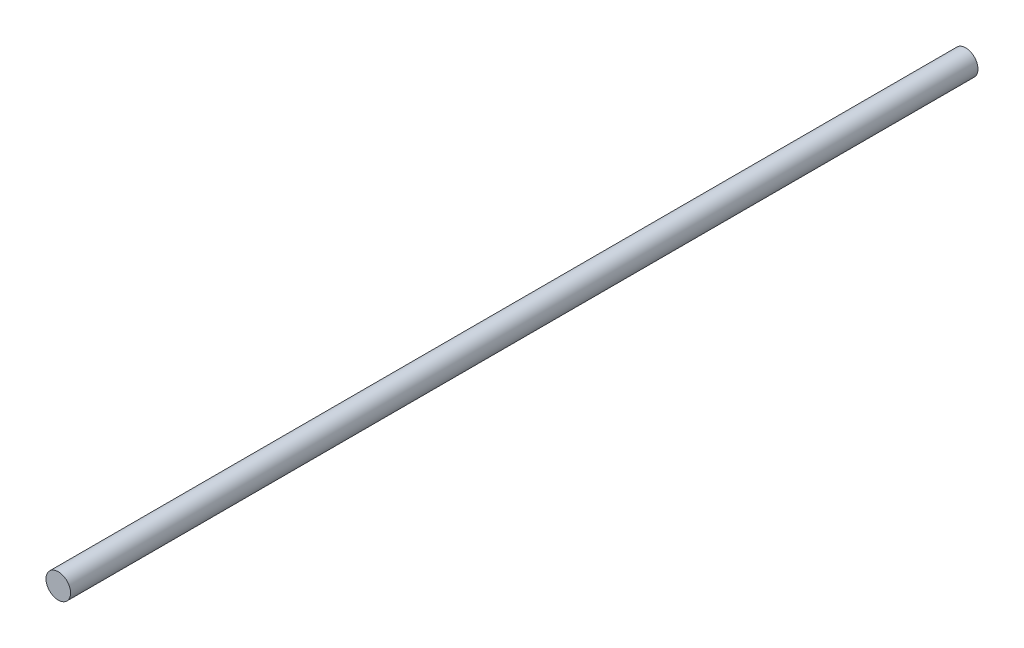
ISO-10303-21;
HEADER;
FILE_DESCRIPTION(('STEP AP214'),'2;1');
FILE_NAME('part.step','',(''),(''),'','','');
FILE_SCHEMA(('AUTOMOTIVE_DESIGN { 1 0 10303 214 1 1 1 1 }'));
ENDSEC;
DATA;
#1=APPLICATION_CONTEXT('core data for automotive mechanical design processes');
#2=APPLICATION_PROTOCOL_DEFINITION('international standard','automotive_design',2000,#1);
#3=PRODUCT_CONTEXT('',#1,'mechanical');
#4=PRODUCT('Part','Part','',(#3));
#5=PRODUCT_RELATED_PRODUCT_CATEGORY('part','',(#4));
#6=PRODUCT_DEFINITION_FORMATION('','',#4);
#7=PRODUCT_DEFINITION_CONTEXT('part definition',#1,'design');
#8=PRODUCT_DEFINITION('design','',#6,#7);
#9=PRODUCT_DEFINITION_SHAPE('','',#8);
#10=(LENGTH_UNIT() NAMED_UNIT(*) SI_UNIT(.MILLI.,.METRE.));
#11=(NAMED_UNIT(*) PLANE_ANGLE_UNIT() SI_UNIT($,.RADIAN.));
#12=(NAMED_UNIT(*) SI_UNIT($,.STERADIAN.) SOLID_ANGLE_UNIT());
#13=UNCERTAINTY_MEASURE_WITH_UNIT(LENGTH_MEASURE(1.E-05),#10,'distance_accuracy_value','');
#14=(GEOMETRIC_REPRESENTATION_CONTEXT(3) GLOBAL_UNCERTAINTY_ASSIGNED_CONTEXT((#13)) GLOBAL_UNIT_ASSIGNED_CONTEXT((#10,
#11,#12)) REPRESENTATION_CONTEXT('',''));
#15=CARTESIAN_POINT('',(0.,0.,0.));
#16=DIRECTION('',(0.,0.,1.));
#17=DIRECTION('',(1.,0.,0.));
#18=AXIS2_PLACEMENT_3D('',#15,#16,#17);
#19=CARTESIAN_POINT('',(0.,0.,295.));
#20=DIRECTION('',(0.,0.,-1.));
#21=DIRECTION('',(-1.,0.,0.));
#22=AXIS2_PLACEMENT_3D('',#19,#20,#21);
#23=CYLINDRICAL_SURFACE('',#22,4.);
#24=CARTESIAN_POINT('',(0.,0.,295.));
#25=DIRECTION('',(0.,0.,1.));
#26=DIRECTION('',(1.,0.,0.));
#27=AXIS2_PLACEMENT_3D('',#24,#25,#26);
#28=CIRCLE('',#27,4.);
#29=CARTESIAN_POINT('',(4.,0.,295.));
#30=VERTEX_POINT('',#29);
#31=EDGE_CURVE('E10',#30,#30,#28,.T.);
#32=ORIENTED_EDGE('',*,*,#31,.F.);
#33=EDGE_LOOP('',(#32));
#34=FACE_BOUND('',#33,.T.);
#35=CARTESIAN_POINT('',(0.,0.,0.));
#36=DIRECTION('',(0.,0.,1.));
#37=DIRECTION('',(1.,0.,0.));
#38=AXIS2_PLACEMENT_3D('',#35,#36,#37);
#39=CIRCLE('',#38,4.);
#40=CARTESIAN_POINT('',(4.,0.,0.));
#41=VERTEX_POINT('',#40);
#42=EDGE_CURVE('E38',#41,#41,#39,.T.);
#43=ORIENTED_EDGE('',*,*,#42,.T.);
#44=EDGE_LOOP('',(#43));
#45=FACE_BOUND('',#44,.T.);
#46=ADVANCED_FACE('F35',(#34,#45),#23,.T.);
#47=CARTESIAN_POINT('',(0.,0.,295.));
#48=DIRECTION('',(0.,0.,1.));
#49=DIRECTION('',(1.,0.,0.));
#50=AXIS2_PLACEMENT_3D('',#47,#48,#49);
#51=PLANE('',#50);
#52=ORIENTED_EDGE('',*,*,#31,.T.);
#53=EDGE_LOOP('',(#52));
#54=FACE_BOUND('',#53,.T.);
#55=ADVANCED_FACE('F50',(#54),#51,.T.);
#56=CARTESIAN_POINT('',(0.,0.,0.));
#57=DIRECTION('',(0.,0.,1.));
#58=DIRECTION('',(1.,0.,0.));
#59=AXIS2_PLACEMENT_3D('',#56,#57,#58);
#60=PLANE('',#59);
#61=ORIENTED_EDGE('',*,*,#42,.F.);
#62=EDGE_LOOP('',(#61));
#63=FACE_BOUND('',#62,.T.);
#64=ADVANCED_FACE('F48',(#63),#60,.F.);
#65=CLOSED_SHELL('',(#46,#55,#64));
#66=MANIFOLD_SOLID_BREP('B2',#65);
#67=ADVANCED_BREP_SHAPE_REPRESENTATION('',(#18,#66),#14);
#68=SHAPE_DEFINITION_REPRESENTATION(#9,#67);
ENDSEC;
END-ISO-10303-21;
